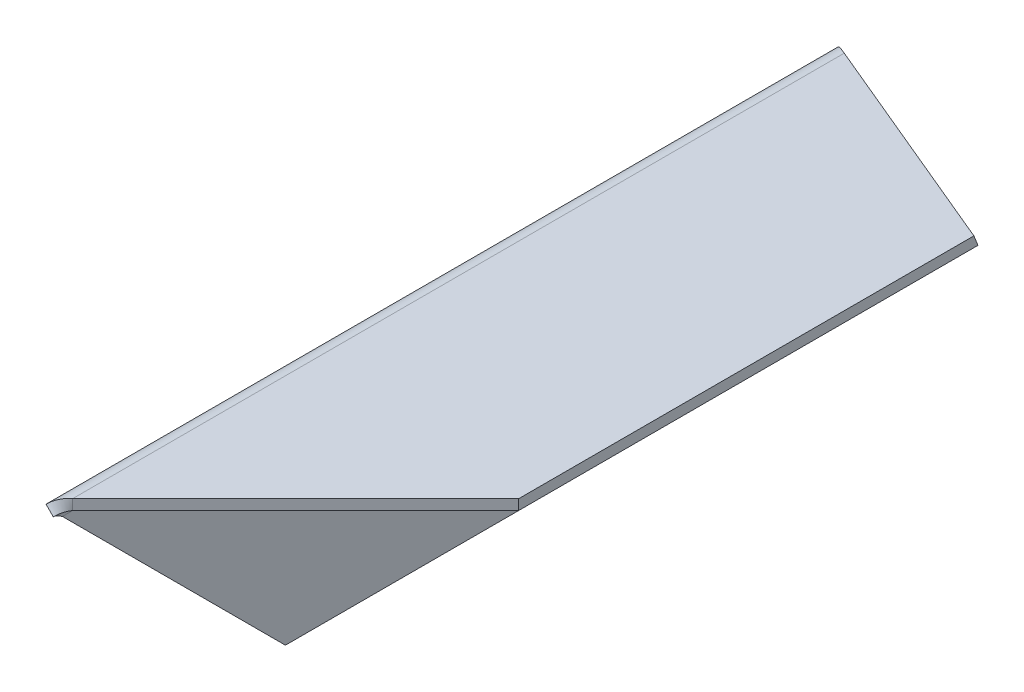
ISO-10303-21;
HEADER;
FILE_DESCRIPTION(('STEP AP214'),'2;1');
FILE_NAME('part.step','',(''),(''),'','','');
FILE_SCHEMA(('AUTOMOTIVE_DESIGN { 1 0 10303 214 1 1 1 1 }'));
ENDSEC;
DATA;
#1=APPLICATION_CONTEXT('core data for automotive mechanical design processes');
#2=APPLICATION_PROTOCOL_DEFINITION('international standard','automotive_design',2000,#1);
#3=PRODUCT_CONTEXT('',#1,'mechanical');
#4=PRODUCT('Part','Part','',(#3));
#5=PRODUCT_RELATED_PRODUCT_CATEGORY('part','',(#4));
#6=PRODUCT_DEFINITION_FORMATION('','',#4);
#7=PRODUCT_DEFINITION_CONTEXT('part definition',#1,'design');
#8=PRODUCT_DEFINITION('design','',#6,#7);
#9=PRODUCT_DEFINITION_SHAPE('','',#8);
#10=(LENGTH_UNIT() NAMED_UNIT(*) SI_UNIT(.MILLI.,.METRE.));
#11=(NAMED_UNIT(*) PLANE_ANGLE_UNIT() SI_UNIT($,.RADIAN.));
#12=(NAMED_UNIT(*) SI_UNIT($,.STERADIAN.) SOLID_ANGLE_UNIT());
#13=UNCERTAINTY_MEASURE_WITH_UNIT(LENGTH_MEASURE(1.E-05),#10,'distance_accuracy_value','');
#14=(GEOMETRIC_REPRESENTATION_CONTEXT(3) GLOBAL_UNCERTAINTY_ASSIGNED_CONTEXT((#13)) GLOBAL_UNIT_ASSIGNED_CONTEXT((#10,
#11,#12)) REPRESENTATION_CONTEXT('',''));
#15=CARTESIAN_POINT('',(0.,0.,0.));
#16=DIRECTION('',(0.,0.,1.));
#17=DIRECTION('',(1.,0.,0.));
#18=AXIS2_PLACEMENT_3D('',#15,#16,#17);
#19=CARTESIAN_POINT('',(-112.900713999999,0.188336430717542,0.));
#20=DIRECTION('',(-1.,0.,0.));
#21=DIRECTION('',(0.,0.,1.));
#22=AXIS2_PLACEMENT_3D('',#19,#20,#21);
#23=PLANE('',#22);
#24=DIRECTION('',(0.,0.928902584452962,0.37032416690868));
#25=VECTOR('',#24,1.);
#26=CARTESIAN_POINT('',(-112.900713999999,-3.37787234321215,8.94529939662034));
#27=LINE('',#26,#25);
#28=CARTESIAN_POINT('',(-112.900714,95.4360504307374,48.3392942489347));
#29=VERTEX_POINT('',#28);
#30=CARTESIAN_POINT('',(-112.900714,111.427514,54.714586473388));
#31=VERTEX_POINT('',#30);
#32=EDGE_CURVE('E48',#29,#31,#27,.T.);
#33=ORIENTED_EDGE('',*,*,#32,.F.);
#34=DIRECTION('',(0.,0.,-1.));
#35=VECTOR('',#34,1.);
#36=CARTESIAN_POINT('',(-112.900714,95.4360504307374,95.2477140000016));
#37=LINE('',#36,#35);
#38=CARTESIAN_POINT('',(-112.900714,95.4360504307374,95.2477140000016));
#39=VERTEX_POINT('',#38);
#40=EDGE_CURVE('E180',#39,#29,#37,.T.);
#41=ORIENTED_EDGE('',*,*,#40,.F.);
#42=DIRECTION('',(0.,-0.707106781186615,-0.70710678118648));
#43=VECTOR('',#42,1.);
#44=CARTESIAN_POINT('',(-112.900714,112.295300430737,112.106963999998));
#45=LINE('',#44,#43);
#46=CARTESIAN_POINT('',(-112.900714,111.427514,111.239177569261));
#47=VERTEX_POINT('',#46);
#48=EDGE_CURVE('E55',#47,#39,#45,.T.);
#49=ORIENTED_EDGE('',*,*,#48,.F.);
#50=DIRECTION('',(0.,0.,-1.));
#51=VECTOR('',#50,1.);
#52=CARTESIAN_POINT('',(-112.900714,111.427514,0.));
#53=LINE('',#52,#51);
#54=EDGE_CURVE('E182',#47,#31,#53,.T.);
#55=ORIENTED_EDGE('',*,*,#54,.T.);
#56=EDGE_LOOP('',(#33,#41,#49,#55));
#57=FACE_BOUND('',#56,.T.);
#58=ADVANCED_FACE('F32',(#57),#23,.T.);
#59=CARTESIAN_POINT('',(-112.164114,112.295300430737,112.106963999998));
#60=DIRECTION('',(0.,0.70710678118648,-0.707106781186615));
#61=DIRECTION('',(0.,0.707106781186615,0.70710678118648));
#62=AXIS2_PLACEMENT_3D('',#59,#60,#61);
#63=PLANE('',#62);
#64=CARTESIAN_POINT('',(-112.900714,111.427514,111.239177569261));
#65=CARTESIAN_POINT('',(-112.164114,111.427514,111.239177569261));
#66=B_SPLINE_CURVE_WITH_KNOTS('',1,(#64,#65),.UNSPECIFIED.,.F.,.F.,(2,2),(0.,1.),.UNSPECIFIED.);
#67=CARTESIAN_POINT('',(-112.164114,111.427514,111.239177569261));
#68=VERTEX_POINT('',#67);
#69=EDGE_CURVE('E41',#47,#68,#66,.T.);
#70=ORIENTED_EDGE('',*,*,#69,.F.);
#71=ORIENTED_EDGE('',*,*,#48,.T.);
#72=DIRECTION('',(-1.,0.,0.));
#73=VECTOR('',#72,1.);
#74=CARTESIAN_POINT('',(-112.164114,95.4360504307374,95.2477140000016));
#75=LINE('',#74,#73);
#76=CARTESIAN_POINT('',(-112.164114,95.4360504307374,95.2477140000016));
#77=VERTEX_POINT('',#76);
#78=EDGE_CURVE('E190',#77,#39,#75,.T.);
#79=ORIENTED_EDGE('',*,*,#78,.F.);
#80=DIRECTION('',(0.,-0.707106781186615,-0.70710678118648));
#81=VECTOR('',#80,1.);
#82=CARTESIAN_POINT('',(-112.164114,112.295300430737,112.106963999998));
#83=LINE('',#82,#81);
#84=EDGE_CURVE('E191',#68,#77,#83,.T.);
#85=ORIENTED_EDGE('',*,*,#84,.F.);
#86=EDGE_LOOP('',(#70,#71,#79,#85));
#87=FACE_BOUND('',#86,.T.);
#88=ADVANCED_FACE('F34',(#87),#63,.F.);
#89=CARTESIAN_POINT('',(-112.164114,95.4360504307374,95.2477140000016));
#90=DIRECTION('',(0.,1.,0.));
#91=DIRECTION('',(0.,0.,1.));
#92=AXIS2_PLACEMENT_3D('',#89,#90,#91);
#93=PLANE('',#92);
#94=ORIENTED_EDGE('',*,*,#40,.T.);
#95=DIRECTION('',(0.922409121004533,0.,0.386214206739791));
#96=VECTOR('',#95,1.);
#97=CARTESIAN_POINT('',(-95.5629787055034,95.4360504307375,55.5986323571011));
#98=LINE('',#97,#96);
#99=CARTESIAN_POINT('',(-112.164114,95.4360504307374,48.6477098729853));
#100=VERTEX_POINT('',#99);
#101=EDGE_CURVE('E187',#29,#100,#98,.T.);
#102=ORIENTED_EDGE('',*,*,#101,.T.);
#103=DIRECTION('',(0.,0.,-1.));
#104=VECTOR('',#103,1.);
#105=CARTESIAN_POINT('',(-112.164114,95.4360504307374,95.2477140000016));
#106=LINE('',#105,#104);
#107=EDGE_CURVE('E193',#77,#100,#106,.T.);
#108=ORIENTED_EDGE('',*,*,#107,.F.);
#109=ORIENTED_EDGE('',*,*,#78,.T.);
#110=EDGE_LOOP('',(#94,#102,#108,#109));
#111=FACE_BOUND('',#110,.T.);
#112=ADVANCED_FACE('F166',(#111),#93,.F.);
#113=CARTESIAN_POINT('',(-112.164113999999,0.188336430717542,0.));
#114=DIRECTION('',(-1.,0.,0.));
#115=DIRECTION('',(0.,0.,1.));
#116=AXIS2_PLACEMENT_3D('',#113,#114,#115);
#117=PLANE('',#116);
#118=ORIENTED_EDGE('',*,*,#107,.T.);
#119=DIRECTION('',(0.,0.928902584452962,0.37032416690868));
#120=VECTOR('',#119,1.);
#121=CARTESIAN_POINT('',(-112.164113999999,-3.48396579916277,9.2114189055056));
#122=LINE('',#121,#120);
#123=CARTESIAN_POINT('',(-112.164114,111.427514,55.0230020974385));
#124=VERTEX_POINT('',#123);
#125=EDGE_CURVE('E364',#100,#124,#122,.T.);
#126=ORIENTED_EDGE('',*,*,#125,.T.);
#127=DIRECTION('',(0.,0.,-1.));
#128=VECTOR('',#127,1.);
#129=CARTESIAN_POINT('',(-112.164114,111.427514,0.));
#130=LINE('',#129,#128);
#131=EDGE_CURVE('E200',#68,#124,#130,.T.);
#132=ORIENTED_EDGE('',*,*,#131,.F.);
#133=ORIENTED_EDGE('',*,*,#84,.T.);
#134=EDGE_LOOP('',(#118,#126,#132,#133));
#135=FACE_BOUND('',#134,.T.);
#136=ADVANCED_FACE('F169',(#135),#117,.F.);
#137=CARTESIAN_POINT('',(-95.436050430738,112.164114,95.2477140000016));
#138=DIRECTION('',(-1.,0.,0.));
#139=DIRECTION('',(0.,0.,-1.));
#140=AXIS2_PLACEMENT_3D('',#137,#138,#139);
#141=PLANE('',#140);
#142=DIRECTION('',(0.,0.,1.));
#143=VECTOR('',#142,1.);
#144=CARTESIAN_POINT('',(-95.436050430738,112.164114,95.2477140000016));
#145=LINE('',#144,#143);
#146=CARTESIAN_POINT('',(-95.436050430738,112.164114,62.3207288485436));
#147=VERTEX_POINT('',#146);
#148=CARTESIAN_POINT('',(-95.436050430738,112.164114,95.2477140000016));
#149=VERTEX_POINT('',#148);
#150=EDGE_CURVE('E136',#147,#149,#145,.T.);
#151=ORIENTED_EDGE('',*,*,#150,.F.);
#152=DIRECTION('',(0.,0.928902584452961,0.370324166908681));
#153=VECTOR('',#152,1.);
#154=CARTESIAN_POINT('',(-95.4360504307381,123.490834750633,66.8363352167353));
#155=LINE('',#154,#153);
#156=CARTESIAN_POINT('',(-95.4360504307381,112.900714,62.6143880394108));
#157=VERTEX_POINT('',#156);
#158=EDGE_CURVE('E115',#147,#157,#155,.T.);
#159=ORIENTED_EDGE('',*,*,#158,.T.);
#160=DIRECTION('',(0.,0.,1.));
#161=VECTOR('',#160,1.);
#162=CARTESIAN_POINT('',(-95.436050430738,112.900714,95.2477140000016));
#163=LINE('',#162,#161);
#164=CARTESIAN_POINT('',(-95.436050430738,112.900714,95.2477140000016));
#165=VERTEX_POINT('',#164);
#166=EDGE_CURVE('E114',#157,#165,#163,.T.);
#167=ORIENTED_EDGE('',*,*,#166,.T.);
#168=DIRECTION('',(0.,1.,0.));
#169=VECTOR('',#168,1.);
#170=CARTESIAN_POINT('',(-95.436050430738,112.164114,95.2477140000016));
#171=LINE('',#170,#169);
#172=EDGE_CURVE('E195',#149,#165,#171,.T.);
#173=ORIENTED_EDGE('',*,*,#172,.F.);
#174=EDGE_LOOP('',(#151,#159,#167,#173));
#175=FACE_BOUND('',#174,.T.);
#176=ADVANCED_FACE('F172',(#175),#141,.F.);
#177=CARTESIAN_POINT('',(-224.402264430758,112.164113999999,0.));
#178=DIRECTION('',(0.,1.,0.));
#179=DIRECTION('',(0.,0.,1.));
#180=AXIS2_PLACEMENT_3D('',#177,#178,#179);
#181=PLANE('',#180);
#182=DIRECTION('',(0.,0.,-1.));
#183=VECTOR('',#182,1.);
#184=CARTESIAN_POINT('',(-111.427514,112.164114,0.));
#185=LINE('',#184,#183);
#186=CARTESIAN_POINT('',(-111.427514,112.164114,111.239177569261));
#187=VERTEX_POINT('',#186);
#188=CARTESIAN_POINT('',(-111.427514,112.164114,55.6250769123563));
#189=VERTEX_POINT('',#188);
#190=EDGE_CURVE('E133',#187,#189,#185,.T.);
#191=ORIENTED_EDGE('',*,*,#190,.T.);
#192=DIRECTION('',(0.922409121004533,0.,0.386214206739789));
#193=VECTOR('',#192,1.);
#194=CARTESIAN_POINT('',(-227.367085942483,112.164113999999,7.08098862455533));
#195=LINE('',#194,#193);
#196=EDGE_CURVE('E183',#189,#147,#195,.T.);
#197=ORIENTED_EDGE('',*,*,#196,.T.);
#198=ORIENTED_EDGE('',*,*,#150,.T.);
#199=DIRECTION('',(-0.707106781186614,0.,0.707106781186481));
#200=VECTOR('',#199,1.);
#201=CARTESIAN_POINT('',(-112.295300430738,112.164114,112.106963999998));
#202=LINE('',#201,#200);
#203=EDGE_CURVE('E126',#149,#187,#202,.T.);
#204=ORIENTED_EDGE('',*,*,#203,.T.);
#205=EDGE_LOOP('',(#191,#197,#198,#204));
#206=FACE_BOUND('',#205,.T.);
#207=ADVANCED_FACE('F366',(#206),#181,.F.);
#208=CARTESIAN_POINT('',(-224.402264430758,112.900713999999,0.));
#209=DIRECTION('',(0.,1.,0.));
#210=DIRECTION('',(0.,0.,1.));
#211=AXIS2_PLACEMENT_3D('',#208,#209,#210);
#212=PLANE('',#211);
#213=DIRECTION('',(0.922409121004533,0.,0.386214206739789));
#214=VECTOR('',#213,1.);
#215=CARTESIAN_POINT('',(-227.471701297125,112.900713999999,7.33084519542916));
#216=LINE('',#215,#214);
#217=CARTESIAN_POINT('',(-111.427514,112.900714,55.9187361032235));
#218=VERTEX_POINT('',#217);
#219=EDGE_CURVE('E103',#218,#157,#216,.T.);
#220=ORIENTED_EDGE('',*,*,#219,.F.);
#221=DIRECTION('',(0.,0.,-1.));
#222=VECTOR('',#221,1.);
#223=CARTESIAN_POINT('',(-111.427514,112.900714,0.));
#224=LINE('',#223,#222);
#225=CARTESIAN_POINT('',(-111.427514,112.900714,111.239177569261));
#226=VERTEX_POINT('',#225);
#227=EDGE_CURVE('E113',#226,#218,#224,.T.);
#228=ORIENTED_EDGE('',*,*,#227,.F.);
#229=DIRECTION('',(-0.707106781186614,0.,0.707106781186481));
#230=VECTOR('',#229,1.);
#231=CARTESIAN_POINT('',(-112.295300430738,112.900714,112.106963999998));
#232=LINE('',#231,#230);
#233=EDGE_CURVE('E152',#165,#226,#232,.T.);
#234=ORIENTED_EDGE('',*,*,#233,.F.);
#235=ORIENTED_EDGE('',*,*,#166,.F.);
#236=EDGE_LOOP('',(#220,#228,#234,#235));
#237=FACE_BOUND('',#236,.T.);
#238=ADVANCED_FACE('F111',(#237),#212,.T.);
#239=CARTESIAN_POINT('',(-112.295300430738,112.164114,112.106963999998));
#240=DIRECTION('',(-0.707106781186481,0.,-0.707106781186614));
#241=DIRECTION('',(0.707106781186614,0.,-0.707106781186481));
#242=AXIS2_PLACEMENT_3D('',#239,#240,#241);
#243=PLANE('',#242);
#244=ORIENTED_EDGE('',*,*,#233,.T.);
#245=CARTESIAN_POINT('',(-111.427514,112.164114,111.239177569261));
#246=CARTESIAN_POINT('',(-111.427514,112.900714,111.239177569261));
#247=B_SPLINE_CURVE_WITH_KNOTS('',1,(#245,#246),.UNSPECIFIED.,.F.,.F.,(2,2),(0.,1.),.UNSPECIFIED.);
#248=EDGE_CURVE('E147',#226,#187,#247,.F.);
#249=ORIENTED_EDGE('',*,*,#248,.T.);
#250=ORIENTED_EDGE('',*,*,#203,.F.);
#251=ORIENTED_EDGE('',*,*,#172,.T.);
#252=EDGE_LOOP('',(#244,#249,#250,#251));
#253=FACE_BOUND('',#252,.T.);
#254=ADVANCED_FACE('F154',(#253),#243,.F.);
#255=CARTESIAN_POINT('',(-112.469223710044,112.469223710044,112.106963999998));
#256=CARTESIAN_POINT('',(-112.605598926777,112.332848493311,111.962316239192));
#257=CARTESIAN_POINT('',(-112.714776107324,112.169445481882,111.817701856419));
#258=CARTESIAN_POINT('',(-112.862370547268,111.813120983238,111.52843971284));
#259=CARTESIAN_POINT('',(-112.900714,111.620377681075,111.383825330067));
#260=CARTESIAN_POINT('',(-112.900714,111.427514,111.239177569261));
#261=CARTESIAN_POINT('',(-111.948368855022,111.948368855022,112.106963999998));
#262=CARTESIAN_POINT('',(-112.016552378456,111.880185331588,111.962324904643));
#263=CARTESIAN_POINT('',(-112.071145053662,111.798479740941,111.817701856419));
#264=CARTESIAN_POINT('',(-112.144942273634,111.620317491619,111.52843971284));
#265=CARTESIAN_POINT('',(-112.164114,111.52394006357,111.383816664616));
#266=CARTESIAN_POINT('',(-112.164114,111.427514,111.239177569261));
#267=B_SPLINE_SURFACE_WITH_KNOTS('',1,3,((#255,#256,#257,#258,#259,#260),(#261,#262,#263,#264,
#265,#266)),.UNSPECIFIED.,.F.,.F.,.F.,(2,2),(4,2,4),(0.,1.),(0.,0.5,1.),.UNSPECIFIED.);
#268=CARTESIAN_POINT('',(-112.469223710044,112.469223710044,112.106963999998));
#269=CARTESIAN_POINT('',(-111.948368855022,111.948368855022,112.106963999998));
#270=B_SPLINE_CURVE_WITH_KNOTS('',1,(#268,#269),.UNSPECIFIED.,.F.,.F.,(2,2),(0.,1.),.UNSPECIFIED.);
#271=CARTESIAN_POINT('',(-112.469223945747,112.469223474341,112.106963749998));
#272=VERTEX_POINT('',#271);
#273=CARTESIAN_POINT('',(-111.948368855022,111.948368855022,112.106963999998));
#274=VERTEX_POINT('',#273);
#275=EDGE_CURVE('E124',#272,#274,#270,.T.);
#276=CARTESIAN_POINT('',(-112.469223710044,112.469223710044,112.106963999998));
#277=CARTESIAN_POINT('',(-112.605598926777,112.332848493311,111.962316239192));
#278=CARTESIAN_POINT('',(-112.714776107324,112.169445481882,111.817701856419));
#279=CARTESIAN_POINT('',(-112.862370547268,111.813120983238,111.52843971284));
#280=CARTESIAN_POINT('',(-112.900714,111.620377681075,111.383825330067));
#281=CARTESIAN_POINT('',(-112.900714,111.427514,111.239177569261));
#282=B_SPLINE_CURVE_WITH_KNOTS('',3,(#276,#277,#278,#279,#280,#281),.UNSPECIFIED.,.F.,.F.,(4,2,
4),(0.,0.5,1.),.UNSPECIFIED.);
#283=EDGE_CURVE('E229',#272,#47,#282,.T.);
#284=CARTESIAN_POINT('',(-112.164114,111.427514,111.239177569261));
#285=CARTESIAN_POINT('',(-112.164114,111.52394006357,111.383816664616));
#286=CARTESIAN_POINT('',(-112.144942273634,111.620317491619,111.52843971284));
#287=CARTESIAN_POINT('',(-112.071145053662,111.798479740941,111.817701856419));
#288=CARTESIAN_POINT('',(-112.016552378456,111.880185331588,111.962324904643));
#289=CARTESIAN_POINT('',(-111.948368855022,111.948368855022,112.106963999998));
#290=B_SPLINE_CURVE_WITH_KNOTS('',3,(#284,#285,#286,#287,#288,#289),.UNSPECIFIED.,.F.,.F.,(4,2,
4),(0.,0.5,1.),.UNSPECIFIED.);
#291=EDGE_CURVE('E226',#274,#68,#290,.F.);
#292=ORIENTED_EDGE('',*,*,#275,.F.);
#293=ORIENTED_EDGE('',*,*,#283,.T.);
#294=ORIENTED_EDGE('',*,*,#69,.T.);
#295=ORIENTED_EDGE('',*,*,#291,.F.);
#296=EDGE_LOOP('',(#292,#293,#294,#295));
#297=FACE_BOUND('',#296,.T.);
#298=ADVANCED_FACE('F164',(#297),#267,.F.);
#299=CARTESIAN_POINT('',(-111.427514,112.900714,111.239177569261));
#300=CARTESIAN_POINT('',(-111.620377681075,112.900714,111.383825330067));
#301=CARTESIAN_POINT('',(-111.813120983238,112.862370547267,111.52843971284));
#302=CARTESIAN_POINT('',(-112.169445481883,112.714776107323,111.817701856419));
#303=CARTESIAN_POINT('',(-112.332848493311,112.605598926776,111.962316239192));
#304=CARTESIAN_POINT('',(-112.469223710044,112.469223710044,112.106963999998));
#305=CARTESIAN_POINT('',(-111.427514,112.164114,111.239177569261));
#306=CARTESIAN_POINT('',(-111.52394006357,112.164114,111.383816664616));
#307=CARTESIAN_POINT('',(-111.620317491619,112.144942273633,111.52843971284));
#308=CARTESIAN_POINT('',(-111.798479740941,112.071145053661,111.817701856419));
#309=CARTESIAN_POINT('',(-111.880185331589,112.016552378455,111.962324904643));
#310=CARTESIAN_POINT('',(-111.948368855022,111.948368855022,112.106963999998));
#311=B_SPLINE_SURFACE_WITH_KNOTS('',1,3,((#299,#300,#301,#302,#303,#304),(#305,#306,#307,#308,
#309,#310)),.UNSPECIFIED.,.F.,.F.,.F.,(2,2),(4,2,4),(0.,1.),(0.,0.5,1.),.UNSPECIFIED.);
#312=CARTESIAN_POINT('',(-111.427514,112.900714,111.239177569261));
#313=CARTESIAN_POINT('',(-111.620377681075,112.900714,111.383825330067));
#314=CARTESIAN_POINT('',(-111.813120983238,112.862370547267,111.52843971284));
#315=CARTESIAN_POINT('',(-112.169445481883,112.714776107323,111.817701856419));
#316=CARTESIAN_POINT('',(-112.332848493311,112.605598926776,111.962316239192));
#317=CARTESIAN_POINT('',(-112.469223710044,112.469223710044,112.106963999998));
#318=B_SPLINE_CURVE_WITH_KNOTS('',3,(#312,#313,#314,#315,#316,#317),.UNSPECIFIED.,.F.,.F.,(4,2,
4),(0.,0.5,1.),.UNSPECIFIED.);
#319=EDGE_CURVE('E121',#226,#272,#318,.T.);
#320=CARTESIAN_POINT('',(-111.948368855022,111.948368855022,112.106963999998));
#321=CARTESIAN_POINT('',(-111.880185331589,112.016552378455,111.962324904643));
#322=CARTESIAN_POINT('',(-111.798479740941,112.071145053661,111.817701856419));
#323=CARTESIAN_POINT('',(-111.620317491619,112.144942273633,111.52843971284));
#324=CARTESIAN_POINT('',(-111.52394006357,112.164114,111.383816664616));
#325=CARTESIAN_POINT('',(-111.427514,112.164114,111.239177569261));
#326=B_SPLINE_CURVE_WITH_KNOTS('',3,(#320,#321,#322,#323,#324,#325),.UNSPECIFIED.,.F.,.F.,(4,2,
4),(0.,0.5,1.),.UNSPECIFIED.);
#327=EDGE_CURVE('E128',#187,#274,#326,.F.);
#328=ORIENTED_EDGE('',*,*,#319,.T.);
#329=ORIENTED_EDGE('',*,*,#275,.T.);
#330=ORIENTED_EDGE('',*,*,#327,.F.);
#331=ORIENTED_EDGE('',*,*,#248,.F.);
#332=EDGE_LOOP('',(#328,#329,#330,#331));
#333=FACE_BOUND('',#332,.T.);
#334=ADVANCED_FACE('F258',(#333),#311,.F.);
#335=CARTESIAN_POINT('',(-111.427514,111.427514,224.221855094246));
#336=DIRECTION('',(0.,0.,-1.));
#337=DIRECTION('',(1.,0.,0.));
#338=AXIS2_PLACEMENT_3D('',#335,#336,#337);
#339=CYLINDRICAL_SURFACE('',#338,0.7366);
#340=CARTESIAN_POINT('',(-111.427514,111.427514,55.3314177214891));
#341=DIRECTION('',(-0.362481996068263,-0.345138706889568,0.865728638508028));
#342=DIRECTION('',(-0.626977982081941,-0.596979635764422,-0.500513660619803));
#343=AXIS2_PLACEMENT_3D('',#340,#341,#342);
#344=ELLIPSE('',#343,0.850843979551647,0.7366);
#345=EDGE_CURVE('E363',#189,#124,#344,.T.);
#346=ORIENTED_EDGE('',*,*,#345,.F.);
#347=ORIENTED_EDGE('',*,*,#190,.F.);
#348=ORIENTED_EDGE('',*,*,#327,.T.);
#349=ORIENTED_EDGE('',*,*,#291,.T.);
#350=ORIENTED_EDGE('',*,*,#131,.T.);
#351=EDGE_LOOP('',(#346,#347,#348,#349,#350));
#352=FACE_BOUND('',#351,.T.);
#353=ADVANCED_FACE('F236',(#352),#339,.F.);
#354=CARTESIAN_POINT('',(-111.427514,111.427514,224.221855094246));
#355=DIRECTION('',(0.,0.,-1.));
#356=DIRECTION('',(1.,0.,0.));
#357=AXIS2_PLACEMENT_3D('',#354,#355,#356);
#358=CYLINDRICAL_SURFACE('',#357,1.4732);
#359=ORIENTED_EDGE('',*,*,#227,.T.);
#360=CARTESIAN_POINT('',(-111.427514,111.427514,55.3314177214891));
#361=DIRECTION('',(-0.362481996068263,-0.345138706889568,0.865728638508028));
#362=DIRECTION('',(-0.626977982081941,-0.596979635764422,-0.500513660619803));
#363=AXIS2_PLACEMENT_3D('',#360,#361,#362);
#364=ELLIPSE('',#363,1.70168795910329,1.4732);
#365=EDGE_CURVE('E11',#218,#31,#364,.T.);
#366=ORIENTED_EDGE('',*,*,#365,.T.);
#367=ORIENTED_EDGE('',*,*,#54,.F.);
#368=ORIENTED_EDGE('',*,*,#283,.F.);
#369=ORIENTED_EDGE('',*,*,#319,.F.);
#370=EDGE_LOOP('',(#359,#366,#367,#368,#369));
#371=FACE_BOUND('',#370,.T.);
#372=ADVANCED_FACE('F118',(#371),#358,.T.);
#373=CARTESIAN_POINT('',(-239.743118636919,19.91063190263,-34.8794305366205));
#374=DIRECTION('',(-0.362481996068263,-0.345138706889568,0.865728638508028));
#375=DIRECTION('',(0.922409121004533,0.,0.386214206739788));
#376=AXIS2_PLACEMENT_3D('',#373,#374,#375);
#377=PLANE('',#376);
#378=ORIENTED_EDGE('',*,*,#101,.F.);
#379=ORIENTED_EDGE('',*,*,#32,.T.);
#380=ORIENTED_EDGE('',*,*,#365,.F.);
#381=ORIENTED_EDGE('',*,*,#219,.T.);
#382=ORIENTED_EDGE('',*,*,#158,.F.);
#383=ORIENTED_EDGE('',*,*,#196,.F.);
#384=ORIENTED_EDGE('',*,*,#345,.T.);
#385=ORIENTED_EDGE('',*,*,#125,.F.);
#386=EDGE_LOOP('',(#378,#379,#380,#381,#382,#383,#384,#385));
#387=FACE_BOUND('',#386,.T.);
#388=ADVANCED_FACE('F102',(#387),#377,.F.);
#389=CLOSED_SHELL('',(#58,#88,#112,#136,#176,#207,#238,#254,#298,#334,#353,#372,#388));
#390=MANIFOLD_SOLID_BREP('B2',#389);
#391=ADVANCED_BREP_SHAPE_REPRESENTATION('',(#18,#390),#14);
#392=SHAPE_DEFINITION_REPRESENTATION(#9,#391);
ENDSEC;
END-ISO-10303-21;
